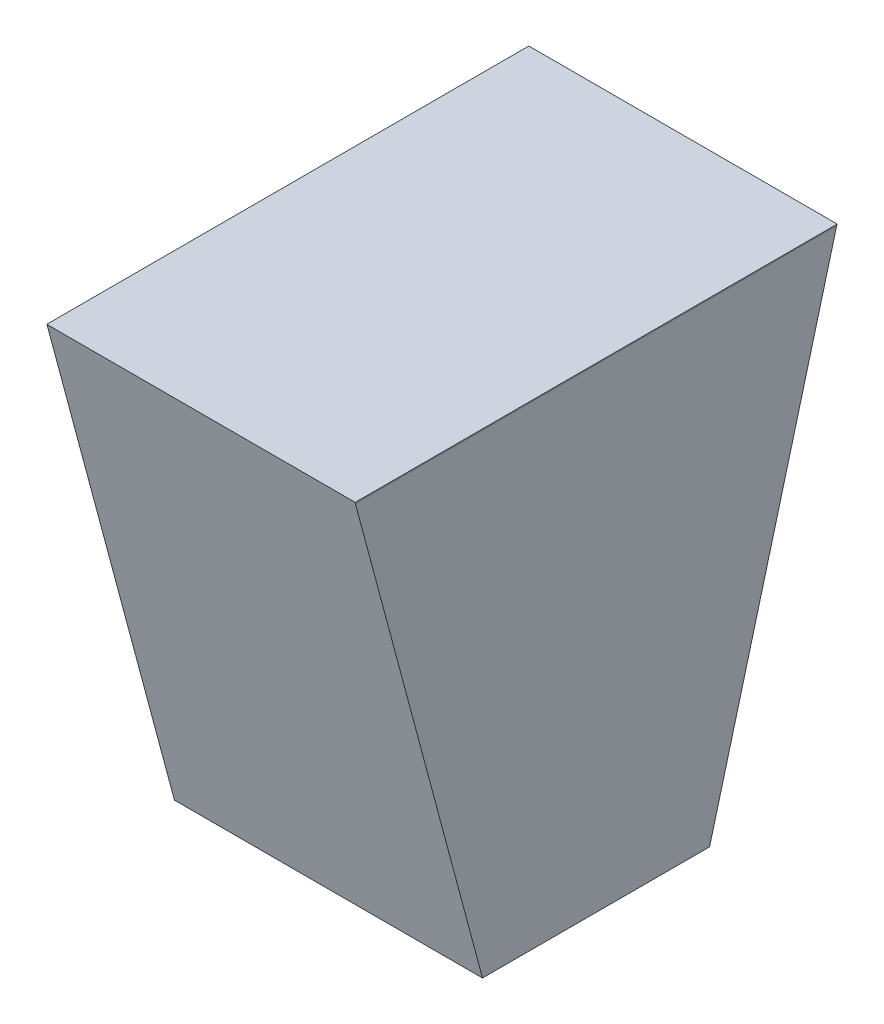
ISO-10303-21;
HEADER;
FILE_DESCRIPTION(('STEP AP214'),'2;1');
FILE_NAME('part.step','',(''),(''),'','','');
FILE_SCHEMA(('AUTOMOTIVE_DESIGN { 1 0 10303 214 1 1 1 1 }'));
ENDSEC;
DATA;
#1=APPLICATION_CONTEXT('core data for automotive mechanical design processes');
#2=APPLICATION_PROTOCOL_DEFINITION('international standard','automotive_design',2000,#1);
#3=PRODUCT_CONTEXT('',#1,'mechanical');
#4=PRODUCT('Part','Part','',(#3));
#5=PRODUCT_RELATED_PRODUCT_CATEGORY('part','',(#4));
#6=PRODUCT_DEFINITION_FORMATION('','',#4);
#7=PRODUCT_DEFINITION_CONTEXT('part definition',#1,'design');
#8=PRODUCT_DEFINITION('design','',#6,#7);
#9=PRODUCT_DEFINITION_SHAPE('','',#8);
#10=(LENGTH_UNIT() NAMED_UNIT(*) SI_UNIT(.MILLI.,.METRE.));
#11=(NAMED_UNIT(*) PLANE_ANGLE_UNIT() SI_UNIT($,.RADIAN.));
#12=(NAMED_UNIT(*) SI_UNIT($,.STERADIAN.) SOLID_ANGLE_UNIT());
#13=UNCERTAINTY_MEASURE_WITH_UNIT(LENGTH_MEASURE(1.E-05),#10,'distance_accuracy_value','');
#14=(GEOMETRIC_REPRESENTATION_CONTEXT(3) GLOBAL_UNCERTAINTY_ASSIGNED_CONTEXT((#13)) GLOBAL_UNIT_ASSIGNED_CONTEXT((#10,
#11,#12)) REPRESENTATION_CONTEXT('',''));
#15=CARTESIAN_POINT('',(0.,0.,0.));
#16=DIRECTION('',(0.,0.,1.));
#17=DIRECTION('',(1.,0.,0.));
#18=AXIS2_PLACEMENT_3D('',#15,#16,#17);
#19=CARTESIAN_POINT('',(0.,0.835526315789467,0.));
#20=DIRECTION('',(0.,1.,0.));
#21=DIRECTION('',(0.,0.,1.));
#22=AXIS2_PLACEMENT_3D('',#19,#20,#21);
#23=PLANE('',#22);
#24=DIRECTION('',(0.,0.,1.));
#25=VECTOR('',#24,1.);
#26=CARTESIAN_POINT('',(0.272118185629609,0.835526315789467,1.50859998));
#27=LINE('',#26,#25);
#28=CARTESIAN_POINT('',(0.272118185629609,0.835526315789467,-0.42326860157074));
#29=VERTEX_POINT('',#28);
#30=CARTESIAN_POINT('',(0.272118185629609,0.835526315789467,0.42326860157074));
#31=VERTEX_POINT('',#30);
#32=EDGE_CURVE('E146',#29,#31,#27,.T.);
#33=ORIENTED_EDGE('',*,*,#32,.F.);
#34=DIRECTION('',(1.,0.,0.));
#35=VECTOR('',#34,1.);
#36=CARTESIAN_POINT('',(1.50859998,0.835526315789467,-0.423268601570739));
#37=LINE('',#36,#35);
#38=CARTESIAN_POINT('',(-0.269578185629609,0.835526315789467,-0.423268601570739));
#39=VERTEX_POINT('',#38);
#40=EDGE_CURVE('E57',#39,#29,#37,.T.);
#41=ORIENTED_EDGE('',*,*,#40,.F.);
#42=DIRECTION('',(0.,0.,-1.));
#43=VECTOR('',#42,1.);
#44=CARTESIAN_POINT('',(-0.269578185629609,0.835526315789467,1.50859998));
#45=LINE('',#44,#43);
#46=CARTESIAN_POINT('',(-0.269578185629609,0.835526315789467,0.42326860157074));
#47=VERTEX_POINT('',#46);
#48=EDGE_CURVE('E12',#47,#39,#45,.T.);
#49=ORIENTED_EDGE('',*,*,#48,.F.);
#50=DIRECTION('',(-1.,0.,0.));
#51=VECTOR('',#50,1.);
#52=CARTESIAN_POINT('',(1.50859998,0.835526315789467,0.423268601570739));
#53=LINE('',#52,#51);
#54=EDGE_CURVE('E93',#31,#47,#53,.T.);
#55=ORIENTED_EDGE('',*,*,#54,.F.);
#56=EDGE_LOOP('',(#33,#41,#49,#55));
#57=FACE_BOUND('',#56,.T.);
#58=ADVANCED_FACE('F42',(#57),#23,.T.);
#59=CARTESIAN_POINT('',(0.27178,0.83312,1.50859998));
#60=DIRECTION('',(0.990268068741571,-0.139173100960058,0.));
#61=DIRECTION('',(0.139173100960058,0.990268068741571,0.));
#62=AXIS2_PLACEMENT_3D('',#59,#60,#61);
#63=PLANE('',#62);
#64=DIRECTION('',(-0.13451818867903,-0.957146646836786,0.256466671058075));
#65=VECTOR('',#64,1.);
#66=CARTESIAN_POINT('',(0.179191767200194,0.174320491687166,-0.246099034971772));
#67=LINE('',#66,#65);
#68=CARTESIAN_POINT('',(0.27178,0.83312,-0.422623831198218));
#69=VERTEX_POINT('',#68);
#70=EDGE_CURVE('E139',#29,#69,#67,.T.);
#71=ORIENTED_EDGE('',*,*,#70,.F.);
#72=ORIENTED_EDGE('',*,*,#32,.T.);
#73=DIRECTION('',(0.13451818867903,0.957146646836786,0.256466671058075));
#74=VECTOR('',#73,1.);
#75=CARTESIAN_POINT('',(0.179191767200194,0.174320491687166,0.246099034971772));
#76=LINE('',#75,#74);
#77=CARTESIAN_POINT('',(0.27178,0.83312,0.422623831198218));
#78=VERTEX_POINT('',#77);
#79=EDGE_CURVE('E103',#78,#31,#76,.T.);
#80=ORIENTED_EDGE('',*,*,#79,.F.);
#81=DIRECTION('',(0.,0.,-1.));
#82=VECTOR('',#81,1.);
#83=CARTESIAN_POINT('',(0.27178,0.83312,1.50859998));
#84=LINE('',#83,#82);
#85=EDGE_CURVE('E144',#78,#69,#84,.T.);
#86=ORIENTED_EDGE('',*,*,#85,.T.);
#87=EDGE_LOOP('',(#71,#72,#80,#86));
#88=FACE_BOUND('',#87,.T.);
#89=ADVANCED_FACE('F149',(#88),#63,.T.);
#90=CARTESIAN_POINT('',(1.50859998,0.,-0.19939));
#91=DIRECTION('',(0.,-0.258819045102522,-0.965925826289068));
#92=DIRECTION('',(0.,0.965925826289068,-0.258819045102522));
#93=AXIS2_PLACEMENT_3D('',#90,#91,#92);
#94=PLANE('',#93);
#95=DIRECTION('',(-0.134518188679037,0.957146646836785,-0.256466671058074));
#96=VECTOR('',#95,1.);
#97=CARTESIAN_POINT('',(-0.122101063869895,-0.213827931123965,-0.142094978536116));
#98=LINE('',#97,#96);
#99=CARTESIAN_POINT('',(-0.26924,0.83312,-0.422623831198218));
#100=VERTEX_POINT('',#99);
#101=EDGE_CURVE('E109',#100,#39,#98,.T.);
#102=ORIENTED_EDGE('',*,*,#101,.T.);
#103=ORIENTED_EDGE('',*,*,#40,.T.);
#104=ORIENTED_EDGE('',*,*,#70,.T.);
#105=DIRECTION('',(0.,-0.965925826289068,0.258819045102522));
#106=VECTOR('',#105,1.);
#107=CARTESIAN_POINT('',(0.27178,0.,-0.19939));
#108=LINE('',#107,#106);
#109=CARTESIAN_POINT('',(0.27178,0.,-0.19939));
#110=VERTEX_POINT('',#109);
#111=EDGE_CURVE('E113',#69,#110,#108,.T.);
#112=ORIENTED_EDGE('',*,*,#111,.T.);
#113=DIRECTION('',(-1.,0.,0.));
#114=VECTOR('',#113,1.);
#115=CARTESIAN_POINT('',(1.50859998,0.,-0.19939));
#116=LINE('',#115,#114);
#117=CARTESIAN_POINT('',(-0.26924,0.,-0.19939));
#118=VERTEX_POINT('',#117);
#119=EDGE_CURVE('E122',#110,#118,#116,.T.);
#120=ORIENTED_EDGE('',*,*,#119,.T.);
#121=DIRECTION('',(0.,0.965925826289068,-0.258819045102522));
#122=VECTOR('',#121,1.);
#123=CARTESIAN_POINT('',(-0.26924,0.,-0.19939));
#124=LINE('',#123,#122);
#125=EDGE_CURVE('E119',#118,#100,#124,.T.);
#126=ORIENTED_EDGE('',*,*,#125,.T.);
#127=EDGE_LOOP('',(#102,#103,#104,#112,#120,#126));
#128=FACE_BOUND('',#127,.T.);
#129=ADVANCED_FACE('F136',(#128),#94,.T.);
#130=CARTESIAN_POINT('',(1.50859998,0.,0.19939));
#131=DIRECTION('',(0.,-0.258819045102522,0.965925826289068));
#132=DIRECTION('',(0.,-0.965925826289068,-0.258819045102522));
#133=AXIS2_PLACEMENT_3D('',#130,#131,#132);
#134=PLANE('',#133);
#135=ORIENTED_EDGE('',*,*,#79,.T.);
#136=ORIENTED_EDGE('',*,*,#54,.T.);
#137=DIRECTION('',(0.134518188679037,-0.957146646836785,-0.256466671058074));
#138=VECTOR('',#137,1.);
#139=CARTESIAN_POINT('',(-0.122101063869895,-0.213827931123965,0.142094978536116));
#140=LINE('',#139,#138);
#141=CARTESIAN_POINT('',(-0.26924,0.83312,0.422623831198218));
#142=VERTEX_POINT('',#141);
#143=EDGE_CURVE('E101',#47,#142,#140,.T.);
#144=ORIENTED_EDGE('',*,*,#143,.T.);
#145=DIRECTION('',(0.,-0.965925826289068,-0.258819045102522));
#146=VECTOR('',#145,1.);
#147=CARTESIAN_POINT('',(-0.26924,0.,0.19939));
#148=LINE('',#147,#146);
#149=CARTESIAN_POINT('',(-0.26924,0.,0.19939));
#150=VERTEX_POINT('',#149);
#151=EDGE_CURVE('E124',#142,#150,#148,.T.);
#152=ORIENTED_EDGE('',*,*,#151,.T.);
#153=DIRECTION('',(-1.,0.,0.));
#154=VECTOR('',#153,1.);
#155=CARTESIAN_POINT('',(1.50859998,0.,0.19939));
#156=LINE('',#155,#154);
#157=CARTESIAN_POINT('',(0.27178,0.,0.19939));
#158=VERTEX_POINT('',#157);
#159=EDGE_CURVE('E64',#158,#150,#156,.T.);
#160=ORIENTED_EDGE('',*,*,#159,.F.);
#161=DIRECTION('',(0.,0.965925826289068,0.258819045102522));
#162=VECTOR('',#161,1.);
#163=CARTESIAN_POINT('',(0.27178,0.,0.19939));
#164=LINE('',#163,#162);
#165=EDGE_CURVE('E134',#158,#78,#164,.T.);
#166=ORIENTED_EDGE('',*,*,#165,.T.);
#167=EDGE_LOOP('',(#135,#136,#144,#152,#160,#166));
#168=FACE_BOUND('',#167,.T.);
#169=ADVANCED_FACE('F100',(#168),#134,.T.);
#170=CARTESIAN_POINT('',(-0.26924,0.83312,1.50859998));
#171=DIRECTION('',(-0.99026806874157,-0.139173100960066,0.));
#172=DIRECTION('',(0.139173100960066,-0.99026806874157,0.));
#173=AXIS2_PLACEMENT_3D('',#170,#171,#172);
#174=PLANE('',#173);
#175=ORIENTED_EDGE('',*,*,#143,.F.);
#176=ORIENTED_EDGE('',*,*,#48,.T.);
#177=ORIENTED_EDGE('',*,*,#101,.F.);
#178=DIRECTION('',(0.,0.,-1.));
#179=VECTOR('',#178,1.);
#180=CARTESIAN_POINT('',(-0.26924,0.83312,1.50859998));
#181=LINE('',#180,#179);
#182=EDGE_CURVE('E108',#142,#100,#181,.T.);
#183=ORIENTED_EDGE('',*,*,#182,.F.);
#184=EDGE_LOOP('',(#175,#176,#177,#183));
#185=FACE_BOUND('',#184,.T.);
#186=ADVANCED_FACE('F106',(#185),#174,.T.);
#187=CARTESIAN_POINT('',(-0.26924,0.82312002,1.50859998));
#188=DIRECTION('',(-1.,0.,0.));
#189=DIRECTION('',(0.,-1.,0.));
#190=AXIS2_PLACEMENT_3D('',#187,#188,#189);
#191=PLANE('',#190);
#192=DIRECTION('',(0.,0.,-1.));
#193=VECTOR('',#192,1.);
#194=CARTESIAN_POINT('',(-0.26924,0.,0.19939));
#195=LINE('',#194,#193);
#196=EDGE_CURVE('E111',#150,#118,#195,.T.);
#197=ORIENTED_EDGE('',*,*,#196,.F.);
#198=ORIENTED_EDGE('',*,*,#151,.F.);
#199=ORIENTED_EDGE('',*,*,#182,.T.);
#200=ORIENTED_EDGE('',*,*,#125,.F.);
#201=EDGE_LOOP('',(#197,#198,#199,#200));
#202=FACE_BOUND('',#201,.T.);
#203=ADVANCED_FACE('F160',(#202),#191,.T.);
#204=CARTESIAN_POINT('',(0.27178,-0.00999998,1.50859998));
#205=DIRECTION('',(1.,0.,0.));
#206=DIRECTION('',(0.,0.,-1.));
#207=AXIS2_PLACEMENT_3D('',#204,#205,#206);
#208=PLANE('',#207);
#209=ORIENTED_EDGE('',*,*,#85,.F.);
#210=ORIENTED_EDGE('',*,*,#165,.F.);
#211=DIRECTION('',(0.,0.,1.));
#212=VECTOR('',#211,1.);
#213=CARTESIAN_POINT('',(0.27178,0.,0.19939));
#214=LINE('',#213,#212);
#215=EDGE_CURVE('E50',#110,#158,#214,.T.);
#216=ORIENTED_EDGE('',*,*,#215,.F.);
#217=ORIENTED_EDGE('',*,*,#111,.F.);
#218=EDGE_LOOP('',(#209,#210,#216,#217));
#219=FACE_BOUND('',#218,.T.);
#220=ADVANCED_FACE('F132',(#219),#208,.T.);
#221=CARTESIAN_POINT('',(0.,0.,0.));
#222=DIRECTION('',(0.,1.,0.));
#223=DIRECTION('',(0.,0.,1.));
#224=AXIS2_PLACEMENT_3D('',#221,#222,#223);
#225=PLANE('',#224);
#226=ORIENTED_EDGE('',*,*,#196,.T.);
#227=ORIENTED_EDGE('',*,*,#119,.F.);
#228=ORIENTED_EDGE('',*,*,#215,.T.);
#229=ORIENTED_EDGE('',*,*,#159,.T.);
#230=EDGE_LOOP('',(#226,#227,#228,#229));
#231=FACE_BOUND('',#230,.T.);
#232=ADVANCED_FACE('F44',(#231),#225,.F.);
#233=CLOSED_SHELL('',(#58,#89,#129,#169,#186,#203,#220,#232));
#234=MANIFOLD_SOLID_BREP('B2',#233);
#235=ADVANCED_BREP_SHAPE_REPRESENTATION('',(#18,#234),#14);
#236=SHAPE_DEFINITION_REPRESENTATION(#9,#235);
ENDSEC;
END-ISO-10303-21;
